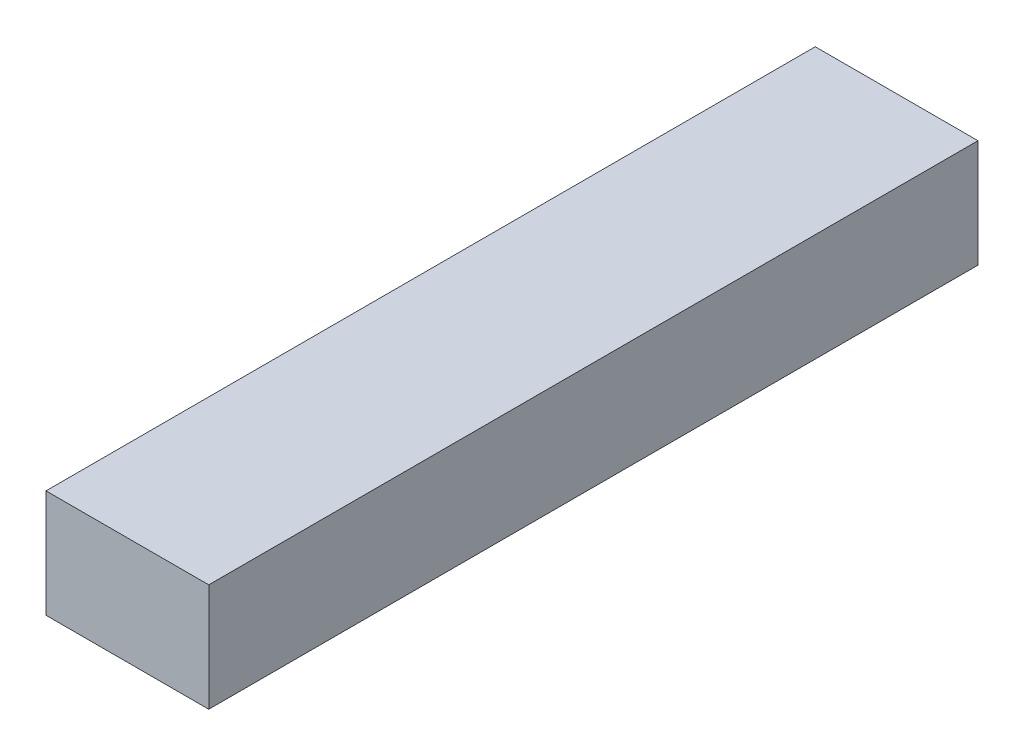
ISO-10303-21;
HEADER;
FILE_DESCRIPTION(('STEP AP214'),'2;1');
FILE_NAME('part.step','',(''),(''),'','','');
FILE_SCHEMA(('AUTOMOTIVE_DESIGN { 1 0 10303 214 1 1 1 1 }'));
ENDSEC;
DATA;
#1=APPLICATION_CONTEXT('core data for automotive mechanical design processes');
#2=APPLICATION_PROTOCOL_DEFINITION('international standard','automotive_design',2000,#1);
#3=PRODUCT_CONTEXT('',#1,'mechanical');
#4=PRODUCT('Part','Part','',(#3));
#5=PRODUCT_RELATED_PRODUCT_CATEGORY('part','',(#4));
#6=PRODUCT_DEFINITION_FORMATION('','',#4);
#7=PRODUCT_DEFINITION_CONTEXT('part definition',#1,'design');
#8=PRODUCT_DEFINITION('design','',#6,#7);
#9=PRODUCT_DEFINITION_SHAPE('','',#8);
#10=(LENGTH_UNIT() NAMED_UNIT(*) SI_UNIT(.MILLI.,.METRE.));
#11=(NAMED_UNIT(*) PLANE_ANGLE_UNIT() SI_UNIT($,.RADIAN.));
#12=(NAMED_UNIT(*) SI_UNIT($,.STERADIAN.) SOLID_ANGLE_UNIT());
#13=UNCERTAINTY_MEASURE_WITH_UNIT(LENGTH_MEASURE(1.E-05),#10,'distance_accuracy_value','');
#14=(GEOMETRIC_REPRESENTATION_CONTEXT(3) GLOBAL_UNCERTAINTY_ASSIGNED_CONTEXT((#13)) GLOBAL_UNIT_ASSIGNED_CONTEXT((#10,
#11,#12)) REPRESENTATION_CONTEXT('',''));
#15=CARTESIAN_POINT('',(0.,0.,0.));
#16=DIRECTION('',(0.,0.,1.));
#17=DIRECTION('',(1.,0.,0.));
#18=AXIS2_PLACEMENT_3D('',#15,#16,#17);
#19=CARTESIAN_POINT('',(22.375,14.815,211.5));
#20=DIRECTION('',(-1.,0.,0.));
#21=DIRECTION('',(0.,-1.,0.));
#22=AXIS2_PLACEMENT_3D('',#19,#20,#21);
#23=PLANE('',#22);
#24=DIRECTION('',(0.,1.,0.));
#25=VECTOR('',#24,1.);
#26=CARTESIAN_POINT('',(22.375,14.815,0.));
#27=LINE('',#26,#25);
#28=CARTESIAN_POINT('',(22.375,-14.815,0.));
#29=VERTEX_POINT('',#28);
#30=CARTESIAN_POINT('',(22.375,14.815,0.));
#31=VERTEX_POINT('',#30);
#32=EDGE_CURVE('E96',#29,#31,#27,.T.);
#33=ORIENTED_EDGE('',*,*,#32,.T.);
#34=DIRECTION('',(0.,0.,-1.));
#35=VECTOR('',#34,1.);
#36=CARTESIAN_POINT('',(22.375,14.815,211.5));
#37=LINE('',#36,#35);
#38=CARTESIAN_POINT('',(22.375,14.815,211.5));
#39=VERTEX_POINT('',#38);
#40=EDGE_CURVE('E11',#39,#31,#37,.T.);
#41=ORIENTED_EDGE('',*,*,#40,.F.);
#42=DIRECTION('',(0.,1.,0.));
#43=VECTOR('',#42,1.);
#44=CARTESIAN_POINT('',(22.375,14.815,211.5));
#45=LINE('',#44,#43);
#46=CARTESIAN_POINT('',(22.375,-14.815,211.5));
#47=VERTEX_POINT('',#46);
#48=EDGE_CURVE('E84',#47,#39,#45,.T.);
#49=ORIENTED_EDGE('',*,*,#48,.F.);
#50=DIRECTION('',(0.,0.,-1.));
#51=VECTOR('',#50,1.);
#52=CARTESIAN_POINT('',(22.375,-14.815,211.5));
#53=LINE('',#52,#51);
#54=EDGE_CURVE('E92',#47,#29,#53,.T.);
#55=ORIENTED_EDGE('',*,*,#54,.T.);
#56=EDGE_LOOP('',(#33,#41,#49,#55));
#57=FACE_BOUND('',#56,.T.);
#58=ADVANCED_FACE('F33',(#57),#23,.F.);
#59=CARTESIAN_POINT('',(-22.375,14.815,211.5));
#60=DIRECTION('',(0.,-1.,0.));
#61=DIRECTION('',(1.,0.,0.));
#62=AXIS2_PLACEMENT_3D('',#59,#60,#61);
#63=PLANE('',#62);
#64=DIRECTION('',(-1.,0.,0.));
#65=VECTOR('',#64,1.);
#66=CARTESIAN_POINT('',(-22.375,14.815,0.));
#67=LINE('',#66,#65);
#68=CARTESIAN_POINT('',(-22.375,14.815,0.));
#69=VERTEX_POINT('',#68);
#70=EDGE_CURVE('E88',#31,#69,#67,.T.);
#71=ORIENTED_EDGE('',*,*,#70,.T.);
#72=DIRECTION('',(0.,0.,-1.));
#73=VECTOR('',#72,1.);
#74=CARTESIAN_POINT('',(-22.375,14.815,211.5));
#75=LINE('',#74,#73);
#76=CARTESIAN_POINT('',(-22.375,14.815,211.5));
#77=VERTEX_POINT('',#76);
#78=EDGE_CURVE('E41',#77,#69,#75,.T.);
#79=ORIENTED_EDGE('',*,*,#78,.F.);
#80=DIRECTION('',(-1.,0.,0.));
#81=VECTOR('',#80,1.);
#82=CARTESIAN_POINT('',(-22.375,14.815,211.5));
#83=LINE('',#82,#81);
#84=EDGE_CURVE('E79',#39,#77,#83,.T.);
#85=ORIENTED_EDGE('',*,*,#84,.F.);
#86=ORIENTED_EDGE('',*,*,#40,.T.);
#87=EDGE_LOOP('',(#71,#79,#85,#86));
#88=FACE_BOUND('',#87,.T.);
#89=ADVANCED_FACE('F87',(#88),#63,.F.);
#90=CARTESIAN_POINT('',(-22.375,14.815,211.5));
#91=DIRECTION('',(1.,0.,0.));
#92=DIRECTION('',(0.,1.,0.));
#93=AXIS2_PLACEMENT_3D('',#90,#91,#92);
#94=PLANE('',#93);
#95=DIRECTION('',(0.,-1.,0.));
#96=VECTOR('',#95,1.);
#97=CARTESIAN_POINT('',(-22.375,14.815,0.));
#98=LINE('',#97,#96);
#99=CARTESIAN_POINT('',(-22.375,-14.815,0.));
#100=VERTEX_POINT('',#99);
#101=EDGE_CURVE('E66',#69,#100,#98,.T.);
#102=ORIENTED_EDGE('',*,*,#101,.T.);
#103=DIRECTION('',(0.,0.,-1.));
#104=VECTOR('',#103,1.);
#105=CARTESIAN_POINT('',(-22.375,-14.815,211.5));
#106=LINE('',#105,#104);
#107=CARTESIAN_POINT('',(-22.375,-14.815,211.5));
#108=VERTEX_POINT('',#107);
#109=EDGE_CURVE('E89',#108,#100,#106,.T.);
#110=ORIENTED_EDGE('',*,*,#109,.F.);
#111=DIRECTION('',(0.,-1.,0.));
#112=VECTOR('',#111,1.);
#113=CARTESIAN_POINT('',(-22.375,14.815,211.5));
#114=LINE('',#113,#112);
#115=EDGE_CURVE('E82',#77,#108,#114,.T.);
#116=ORIENTED_EDGE('',*,*,#115,.F.);
#117=ORIENTED_EDGE('',*,*,#78,.T.);
#118=EDGE_LOOP('',(#102,#110,#116,#117));
#119=FACE_BOUND('',#118,.T.);
#120=ADVANCED_FACE('F90',(#119),#94,.F.);
#121=CARTESIAN_POINT('',(-22.375,-14.815,211.5));
#122=DIRECTION('',(0.,1.,0.));
#123=DIRECTION('',(0.,0.,1.));
#124=AXIS2_PLACEMENT_3D('',#121,#122,#123);
#125=PLANE('',#124);
#126=DIRECTION('',(1.,0.,0.));
#127=VECTOR('',#126,1.);
#128=CARTESIAN_POINT('',(-22.375,-14.815,0.));
#129=LINE('',#128,#127);
#130=EDGE_CURVE('E72',#100,#29,#129,.T.);
#131=ORIENTED_EDGE('',*,*,#130,.T.);
#132=ORIENTED_EDGE('',*,*,#54,.F.);
#133=DIRECTION('',(1.,0.,0.));
#134=VECTOR('',#133,1.);
#135=CARTESIAN_POINT('',(-22.375,-14.815,211.5));
#136=LINE('',#135,#134);
#137=EDGE_CURVE('E49',#108,#47,#136,.T.);
#138=ORIENTED_EDGE('',*,*,#137,.F.);
#139=ORIENTED_EDGE('',*,*,#109,.T.);
#140=EDGE_LOOP('',(#131,#132,#138,#139));
#141=FACE_BOUND('',#140,.T.);
#142=ADVANCED_FACE('F103',(#141),#125,.F.);
#143=CARTESIAN_POINT('',(0.,0.,211.5));
#144=DIRECTION('',(0.,0.,1.));
#145=DIRECTION('',(1.,0.,0.));
#146=AXIS2_PLACEMENT_3D('',#143,#144,#145);
#147=PLANE('',#146);
#148=ORIENTED_EDGE('',*,*,#48,.T.);
#149=ORIENTED_EDGE('',*,*,#84,.T.);
#150=ORIENTED_EDGE('',*,*,#115,.T.);
#151=ORIENTED_EDGE('',*,*,#137,.T.);
#152=EDGE_LOOP('',(#148,#149,#150,#151));
#153=FACE_BOUND('',#152,.T.);
#154=ADVANCED_FACE('F80',(#153),#147,.T.);
#155=CARTESIAN_POINT('',(0.,0.,0.));
#156=DIRECTION('',(0.,0.,1.));
#157=DIRECTION('',(1.,0.,0.));
#158=AXIS2_PLACEMENT_3D('',#155,#156,#157);
#159=PLANE('',#158);
#160=ORIENTED_EDGE('',*,*,#32,.F.);
#161=ORIENTED_EDGE('',*,*,#130,.F.);
#162=ORIENTED_EDGE('',*,*,#101,.F.);
#163=ORIENTED_EDGE('',*,*,#70,.F.);
#164=EDGE_LOOP('',(#160,#161,#162,#163));
#165=FACE_BOUND('',#164,.T.);
#166=ADVANCED_FACE('F106',(#165),#159,.F.);
#167=CLOSED_SHELL('',(#58,#89,#120,#142,#154,#166));
#168=MANIFOLD_SOLID_BREP('B2',#167);
#169=ADVANCED_BREP_SHAPE_REPRESENTATION('',(#18,#168),#14);
#170=SHAPE_DEFINITION_REPRESENTATION(#9,#169);
ENDSEC;
END-ISO-10303-21;
